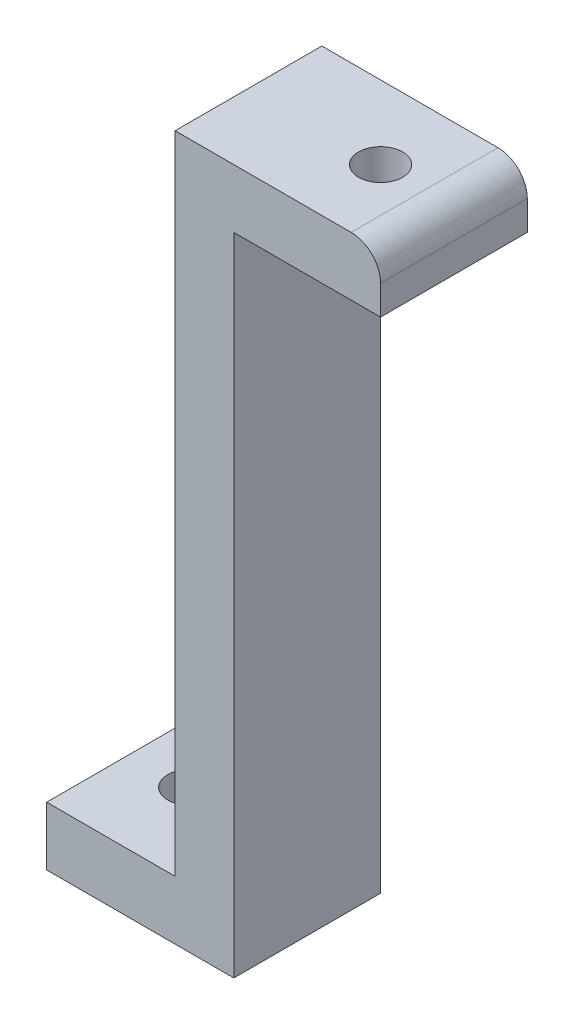
ISO-10303-21;
HEADER;
FILE_DESCRIPTION(('STEP AP214'),'2;1');
FILE_NAME('part.step','',(''),(''),'','','');
FILE_SCHEMA(('AUTOMOTIVE_DESIGN { 1 0 10303 214 1 1 1 1 }'));
ENDSEC;
DATA;
#1=APPLICATION_CONTEXT('core data for automotive mechanical design processes');
#2=APPLICATION_PROTOCOL_DEFINITION('international standard','automotive_design',2000,#1);
#3=PRODUCT_CONTEXT('',#1,'mechanical');
#4=PRODUCT('Part','Part','',(#3));
#5=PRODUCT_RELATED_PRODUCT_CATEGORY('part','',(#4));
#6=PRODUCT_DEFINITION_FORMATION('','',#4);
#7=PRODUCT_DEFINITION_CONTEXT('part definition',#1,'design');
#8=PRODUCT_DEFINITION('design','',#6,#7);
#9=PRODUCT_DEFINITION_SHAPE('','',#8);
#10=(LENGTH_UNIT() NAMED_UNIT(*) SI_UNIT(.MILLI.,.METRE.));
#11=(NAMED_UNIT(*) PLANE_ANGLE_UNIT() SI_UNIT($,.RADIAN.));
#12=(NAMED_UNIT(*) SI_UNIT($,.STERADIAN.) SOLID_ANGLE_UNIT());
#13=UNCERTAINTY_MEASURE_WITH_UNIT(LENGTH_MEASURE(1.E-05),#10,'distance_accuracy_value','');
#14=(GEOMETRIC_REPRESENTATION_CONTEXT(3) GLOBAL_UNCERTAINTY_ASSIGNED_CONTEXT((#13)) GLOBAL_UNIT_ASSIGNED_CONTEXT((#10,
#11,#12)) REPRESENTATION_CONTEXT('',''));
#15=CARTESIAN_POINT('',(0.,0.,0.));
#16=DIRECTION('',(0.,0.,1.));
#17=DIRECTION('',(1.,0.,0.));
#18=AXIS2_PLACEMENT_3D('',#15,#16,#17);
#19=CARTESIAN_POINT('',(0.,-4.,10.));
#20=DIRECTION('',(-1.,0.,0.));
#21=DIRECTION('',(0.,0.,1.));
#22=AXIS2_PLACEMENT_3D('',#19,#20,#21);
#23=PLANE('',#22);
#24=DIRECTION('',(0.,1.,0.));
#25=VECTOR('',#24,1.);
#26=CARTESIAN_POINT('',(0.,-4.,0.));
#27=LINE('',#26,#25);
#28=CARTESIAN_POINT('',(0.,-4.,0.));
#29=VERTEX_POINT('',#28);
#30=CARTESIAN_POINT('',(0.,-2.,0.));
#31=VERTEX_POINT('',#30);
#32=EDGE_CURVE('E144',#29,#31,#27,.T.);
#33=ORIENTED_EDGE('',*,*,#32,.T.);
#34=DIRECTION('',(0.,0.,-1.));
#35=VECTOR('',#34,1.);
#36=CARTESIAN_POINT('',(0.,-2.,10.));
#37=LINE('',#36,#35);
#38=CARTESIAN_POINT('',(0.,-2.,10.));
#39=VERTEX_POINT('',#38);
#40=EDGE_CURVE('E44',#31,#39,#37,.F.);
#41=ORIENTED_EDGE('',*,*,#40,.T.);
#42=DIRECTION('',(0.,1.,0.));
#43=VECTOR('',#42,1.);
#44=CARTESIAN_POINT('',(0.,-4.,10.));
#45=LINE('',#44,#43);
#46=CARTESIAN_POINT('',(0.,-4.,10.));
#47=VERTEX_POINT('',#46);
#48=EDGE_CURVE('E116',#47,#39,#45,.T.);
#49=ORIENTED_EDGE('',*,*,#48,.F.);
#50=DIRECTION('',(0.,0.,-1.));
#51=VECTOR('',#50,1.);
#52=CARTESIAN_POINT('',(0.,-4.,10.));
#53=LINE('',#52,#51);
#54=EDGE_CURVE('E143',#47,#29,#53,.T.);
#55=ORIENTED_EDGE('',*,*,#54,.T.);
#56=EDGE_LOOP('',(#33,#41,#49,#55));
#57=FACE_BOUND('',#56,.T.);
#58=ADVANCED_FACE('F36',(#57),#23,.F.);
#59=CARTESIAN_POINT('',(0.,0.,10.));
#60=DIRECTION('',(0.,-1.,0.));
#61=DIRECTION('',(1.,0.,0.));
#62=AXIS2_PLACEMENT_3D('',#59,#60,#61);
#63=PLANE('',#62);
#64=CARTESIAN_POINT('',(-5.,0.,5.));
#65=DIRECTION('',(0.,-1.,0.));
#66=DIRECTION('',(1.,0.,0.));
#67=AXIS2_PLACEMENT_3D('',#64,#65,#66);
#68=CIRCLE('',#67,1.5);
#69=CARTESIAN_POINT('',(-3.5,0.,5.));
#70=VERTEX_POINT('',#69);
#71=EDGE_CURVE('E208',#70,#70,#68,.T.);
#72=ORIENTED_EDGE('',*,*,#71,.T.);
#73=EDGE_LOOP('',(#72));
#74=FACE_BOUND('',#73,.T.);
#75=DIRECTION('',(-1.,0.,0.));
#76=VECTOR('',#75,1.);
#77=CARTESIAN_POINT('',(0.,0.,10.));
#78=LINE('',#77,#76);
#79=CARTESIAN_POINT('',(-2.,0.,10.));
#80=VERTEX_POINT('',#79);
#81=CARTESIAN_POINT('',(-14.,0.,10.));
#82=VERTEX_POINT('',#81);
#83=EDGE_CURVE('E106',#80,#82,#78,.T.);
#84=ORIENTED_EDGE('',*,*,#83,.F.);
#85=DIRECTION('',(0.,0.,-1.));
#86=VECTOR('',#85,1.);
#87=CARTESIAN_POINT('',(-2.,0.,10.));
#88=LINE('',#87,#86);
#89=CARTESIAN_POINT('',(-2.,0.,0.));
#90=VERTEX_POINT('',#89);
#91=EDGE_CURVE('E124',#80,#90,#88,.T.);
#92=ORIENTED_EDGE('',*,*,#91,.T.);
#93=DIRECTION('',(-1.,0.,0.));
#94=VECTOR('',#93,1.);
#95=CARTESIAN_POINT('',(0.,0.,0.));
#96=LINE('',#95,#94);
#97=CARTESIAN_POINT('',(-14.,0.,0.));
#98=VERTEX_POINT('',#97);
#99=EDGE_CURVE('E121',#90,#98,#96,.T.);
#100=ORIENTED_EDGE('',*,*,#99,.T.);
#101=DIRECTION('',(0.,0.,-1.));
#102=VECTOR('',#101,1.);
#103=CARTESIAN_POINT('',(-14.,0.,10.));
#104=LINE('',#103,#102);
#105=EDGE_CURVE('E119',#82,#98,#104,.T.);
#106=ORIENTED_EDGE('',*,*,#105,.F.);
#107=EDGE_LOOP('',(#84,#92,#100,#106));
#108=FACE_BOUND('',#107,.T.);
#109=ADVANCED_FACE('F120',(#74,#108),#63,.F.);
#110=CARTESIAN_POINT('',(-14.,0.,10.));
#111=DIRECTION('',(1.,0.,0.));
#112=DIRECTION('',(0.,1.,0.));
#113=AXIS2_PLACEMENT_3D('',#110,#111,#112);
#114=PLANE('',#113);
#115=DIRECTION('',(0.,-1.,0.));
#116=VECTOR('',#115,1.);
#117=CARTESIAN_POINT('',(-14.,0.,0.));
#118=LINE('',#117,#116);
#119=CARTESIAN_POINT('',(-14.,-44.,0.));
#120=VERTEX_POINT('',#119);
#121=EDGE_CURVE('E148',#98,#120,#118,.T.);
#122=ORIENTED_EDGE('',*,*,#121,.T.);
#123=DIRECTION('',(0.,0.,-1.));
#124=VECTOR('',#123,1.);
#125=CARTESIAN_POINT('',(-14.,-44.,10.));
#126=LINE('',#125,#124);
#127=CARTESIAN_POINT('',(-14.,-44.,10.));
#128=VERTEX_POINT('',#127);
#129=EDGE_CURVE('E125',#128,#120,#126,.T.);
#130=ORIENTED_EDGE('',*,*,#129,.F.);
#131=DIRECTION('',(0.,-1.,0.));
#132=VECTOR('',#131,1.);
#133=CARTESIAN_POINT('',(-14.,0.,10.));
#134=LINE('',#133,#132);
#135=EDGE_CURVE('E110',#82,#128,#134,.T.);
#136=ORIENTED_EDGE('',*,*,#135,.F.);
#137=ORIENTED_EDGE('',*,*,#105,.T.);
#138=EDGE_LOOP('',(#122,#130,#136,#137));
#139=FACE_BOUND('',#138,.T.);
#140=ADVANCED_FACE('F127',(#139),#114,.F.);
#141=CARTESIAN_POINT('',(-14.,-44.,10.));
#142=DIRECTION('',(0.,-1.,0.));
#143=DIRECTION('',(0.,0.,-1.));
#144=AXIS2_PLACEMENT_3D('',#141,#142,#143);
#145=PLANE('',#144);
#146=CARTESIAN_POINT('',(-18.75,-44.,4.25));
#147=DIRECTION('',(0.,1.,0.));
#148=DIRECTION('',(0.,0.,1.));
#149=AXIS2_PLACEMENT_3D('',#146,#147,#148);
#150=CIRCLE('',#149,1.5);
#151=CARTESIAN_POINT('',(-18.75,-44.,5.75));
#152=VERTEX_POINT('',#151);
#153=EDGE_CURVE('E177',#152,#152,#150,.T.);
#154=ORIENTED_EDGE('',*,*,#153,.F.);
#155=EDGE_LOOP('',(#154));
#156=FACE_BOUND('',#155,.T.);
#157=DIRECTION('',(-1.,0.,0.));
#158=VECTOR('',#157,1.);
#159=CARTESIAN_POINT('',(-14.,-44.,0.));
#160=LINE('',#159,#158);
#161=CARTESIAN_POINT('',(-22.75,-44.,0.));
#162=VERTEX_POINT('',#161);
#163=EDGE_CURVE('E150',#120,#162,#160,.T.);
#164=ORIENTED_EDGE('',*,*,#163,.T.);
#165=DIRECTION('',(0.,0.,-1.));
#166=VECTOR('',#165,1.);
#167=CARTESIAN_POINT('',(-22.75,-44.,10.));
#168=LINE('',#167,#166);
#169=CARTESIAN_POINT('',(-22.75,-44.,10.));
#170=VERTEX_POINT('',#169);
#171=EDGE_CURVE('E171',#170,#162,#168,.T.);
#172=ORIENTED_EDGE('',*,*,#171,.F.);
#173=DIRECTION('',(-1.,0.,0.));
#174=VECTOR('',#173,1.);
#175=CARTESIAN_POINT('',(-14.,-44.,10.));
#176=LINE('',#175,#174);
#177=EDGE_CURVE('E130',#128,#170,#176,.T.);
#178=ORIENTED_EDGE('',*,*,#177,.F.);
#179=ORIENTED_EDGE('',*,*,#129,.T.);
#180=EDGE_LOOP('',(#164,#172,#178,#179));
#181=FACE_BOUND('',#180,.T.);
#182=ADVANCED_FACE('F184',(#156,#181),#145,.F.);
#183=CARTESIAN_POINT('',(-22.75,-44.,10.));
#184=DIRECTION('',(1.,0.,0.));
#185=DIRECTION('',(0.,0.,-1.));
#186=AXIS2_PLACEMENT_3D('',#183,#184,#185);
#187=PLANE('',#186);
#188=DIRECTION('',(0.,-1.,0.));
#189=VECTOR('',#188,1.);
#190=CARTESIAN_POINT('',(-22.75,-44.,0.));
#191=LINE('',#190,#189);
#192=CARTESIAN_POINT('',(-22.75,-48.,0.));
#193=VERTEX_POINT('',#192);
#194=EDGE_CURVE('E152',#162,#193,#191,.T.);
#195=ORIENTED_EDGE('',*,*,#194,.T.);
#196=DIRECTION('',(0.,0.,-1.));
#197=VECTOR('',#196,1.);
#198=CARTESIAN_POINT('',(-22.75,-48.,10.));
#199=LINE('',#198,#197);
#200=CARTESIAN_POINT('',(-22.75,-48.,10.));
#201=VERTEX_POINT('',#200);
#202=EDGE_CURVE('E168',#201,#193,#199,.T.);
#203=ORIENTED_EDGE('',*,*,#202,.F.);
#204=DIRECTION('',(0.,-1.,0.));
#205=VECTOR('',#204,1.);
#206=CARTESIAN_POINT('',(-22.75,-44.,10.));
#207=LINE('',#206,#205);
#208=EDGE_CURVE('E132',#170,#201,#207,.T.);
#209=ORIENTED_EDGE('',*,*,#208,.F.);
#210=ORIENTED_EDGE('',*,*,#171,.T.);
#211=EDGE_LOOP('',(#195,#203,#209,#210));
#212=FACE_BOUND('',#211,.T.);
#213=ADVANCED_FACE('F191',(#212),#187,.F.);
#214=CARTESIAN_POINT('',(-22.75,-48.,10.));
#215=DIRECTION('',(0.,1.,0.));
#216=DIRECTION('',(0.,0.,1.));
#217=AXIS2_PLACEMENT_3D('',#214,#215,#216);
#218=PLANE('',#217);
#219=CARTESIAN_POINT('',(-18.75,-48.,4.25));
#220=DIRECTION('',(0.,1.,0.));
#221=DIRECTION('',(0.,0.,1.));
#222=AXIS2_PLACEMENT_3D('',#219,#220,#221);
#223=CIRCLE('',#222,1.5);
#224=CARTESIAN_POINT('',(-18.75,-48.,5.75));
#225=VERTEX_POINT('',#224);
#226=EDGE_CURVE('E146',#225,#225,#223,.T.);
#227=ORIENTED_EDGE('',*,*,#226,.T.);
#228=EDGE_LOOP('',(#227));
#229=FACE_BOUND('',#228,.T.);
#230=DIRECTION('',(1.,0.,0.));
#231=VECTOR('',#230,1.);
#232=CARTESIAN_POINT('',(-22.75,-48.,0.));
#233=LINE('',#232,#231);
#234=CARTESIAN_POINT('',(-10.,-48.,0.));
#235=VERTEX_POINT('',#234);
#236=EDGE_CURVE('E154',#193,#235,#233,.T.);
#237=ORIENTED_EDGE('',*,*,#236,.T.);
#238=DIRECTION('',(0.,0.,-1.));
#239=VECTOR('',#238,1.);
#240=CARTESIAN_POINT('',(-10.,-48.,10.));
#241=LINE('',#240,#239);
#242=CARTESIAN_POINT('',(-10.,-48.,10.));
#243=VERTEX_POINT('',#242);
#244=EDGE_CURVE('E165',#243,#235,#241,.T.);
#245=ORIENTED_EDGE('',*,*,#244,.F.);
#246=DIRECTION('',(1.,0.,0.));
#247=VECTOR('',#246,1.);
#248=CARTESIAN_POINT('',(-22.75,-48.,10.));
#249=LINE('',#248,#247);
#250=EDGE_CURVE('E137',#201,#243,#249,.T.);
#251=ORIENTED_EDGE('',*,*,#250,.F.);
#252=ORIENTED_EDGE('',*,*,#202,.T.);
#253=EDGE_LOOP('',(#237,#245,#251,#252));
#254=FACE_BOUND('',#253,.T.);
#255=ADVANCED_FACE('F194',(#229,#254),#218,.F.);
#256=CARTESIAN_POINT('',(-10.,-48.,10.));
#257=DIRECTION('',(-1.,0.,0.));
#258=DIRECTION('',(0.,0.,1.));
#259=AXIS2_PLACEMENT_3D('',#256,#257,#258);
#260=PLANE('',#259);
#261=DIRECTION('',(0.,1.,0.));
#262=VECTOR('',#261,1.);
#263=CARTESIAN_POINT('',(-10.,-48.,0.));
#264=LINE('',#263,#262);
#265=CARTESIAN_POINT('',(-10.,-4.,0.));
#266=VERTEX_POINT('',#265);
#267=EDGE_CURVE('E156',#235,#266,#264,.T.);
#268=ORIENTED_EDGE('',*,*,#267,.T.);
#269=DIRECTION('',(0.,0.,-1.));
#270=VECTOR('',#269,1.);
#271=CARTESIAN_POINT('',(-10.,-4.,10.));
#272=LINE('',#271,#270);
#273=CARTESIAN_POINT('',(-10.,-4.,10.));
#274=VERTEX_POINT('',#273);
#275=EDGE_CURVE('E162',#274,#266,#272,.T.);
#276=ORIENTED_EDGE('',*,*,#275,.F.);
#277=DIRECTION('',(0.,1.,0.));
#278=VECTOR('',#277,1.);
#279=CARTESIAN_POINT('',(-10.,-48.,10.));
#280=LINE('',#279,#278);
#281=EDGE_CURVE('E139',#243,#274,#280,.T.);
#282=ORIENTED_EDGE('',*,*,#281,.F.);
#283=ORIENTED_EDGE('',*,*,#244,.T.);
#284=EDGE_LOOP('',(#268,#276,#282,#283));
#285=FACE_BOUND('',#284,.T.);
#286=ADVANCED_FACE('F199',(#285),#260,.F.);
#287=CARTESIAN_POINT('',(-10.,-4.,10.));
#288=DIRECTION('',(0.,1.,0.));
#289=DIRECTION('',(0.,0.,1.));
#290=AXIS2_PLACEMENT_3D('',#287,#288,#289);
#291=PLANE('',#290);
#292=CARTESIAN_POINT('',(-5.,-4.,5.));
#293=DIRECTION('',(0.,-1.,0.));
#294=DIRECTION('',(0.,0.,-1.));
#295=AXIS2_PLACEMENT_3D('',#292,#293,#294);
#296=CIRCLE('',#295,1.5);
#297=CARTESIAN_POINT('',(-5.,-4.,3.5));
#298=VERTEX_POINT('',#297);
#299=EDGE_CURVE('E211',#298,#298,#296,.T.);
#300=ORIENTED_EDGE('',*,*,#299,.F.);
#301=EDGE_LOOP('',(#300));
#302=FACE_BOUND('',#301,.T.);
#303=DIRECTION('',(1.,0.,0.));
#304=VECTOR('',#303,1.);
#305=CARTESIAN_POINT('',(-10.,-4.,0.));
#306=LINE('',#305,#304);
#307=EDGE_CURVE('E158',#266,#29,#306,.T.);
#308=ORIENTED_EDGE('',*,*,#307,.T.);
#309=ORIENTED_EDGE('',*,*,#54,.F.);
#310=DIRECTION('',(1.,0.,0.));
#311=VECTOR('',#310,1.);
#312=CARTESIAN_POINT('',(-10.,-4.,10.));
#313=LINE('',#312,#311);
#314=EDGE_CURVE('E141',#274,#47,#313,.T.);
#315=ORIENTED_EDGE('',*,*,#314,.F.);
#316=ORIENTED_EDGE('',*,*,#275,.T.);
#317=EDGE_LOOP('',(#308,#309,#315,#316));
#318=FACE_BOUND('',#317,.T.);
#319=ADVANCED_FACE('F203',(#302,#318),#291,.F.);
#320=CARTESIAN_POINT('',(0.,0.,10.));
#321=DIRECTION('',(0.,0.,1.));
#322=DIRECTION('',(1.,0.,0.));
#323=AXIS2_PLACEMENT_3D('',#320,#321,#322);
#324=PLANE('',#323);
#325=ORIENTED_EDGE('',*,*,#48,.T.);
#326=CARTESIAN_POINT('',(-2.,-2.,10.));
#327=DIRECTION('',(0.,0.,1.));
#328=DIRECTION('',(1.,0.,0.));
#329=AXIS2_PLACEMENT_3D('',#326,#327,#328);
#330=CIRCLE('',#329,2.);
#331=EDGE_CURVE('E11',#39,#80,#330,.T.);
#332=ORIENTED_EDGE('',*,*,#331,.T.);
#333=ORIENTED_EDGE('',*,*,#83,.T.);
#334=ORIENTED_EDGE('',*,*,#135,.T.);
#335=ORIENTED_EDGE('',*,*,#177,.T.);
#336=ORIENTED_EDGE('',*,*,#208,.T.);
#337=ORIENTED_EDGE('',*,*,#250,.T.);
#338=ORIENTED_EDGE('',*,*,#281,.T.);
#339=ORIENTED_EDGE('',*,*,#314,.T.);
#340=EDGE_LOOP('',(#325,#332,#333,#334,#335,#336,#337,#338,#339));
#341=FACE_BOUND('',#340,.T.);
#342=ADVANCED_FACE('F108',(#341),#324,.T.);
#343=CARTESIAN_POINT('',(0.,0.,0.));
#344=DIRECTION('',(0.,0.,1.));
#345=DIRECTION('',(1.,0.,0.));
#346=AXIS2_PLACEMENT_3D('',#343,#344,#345);
#347=PLANE('',#346);
#348=ORIENTED_EDGE('',*,*,#99,.F.);
#349=CARTESIAN_POINT('',(-2.,-2.,0.));
#350=DIRECTION('',(0.,0.,1.));
#351=DIRECTION('',(1.,0.,0.));
#352=AXIS2_PLACEMENT_3D('',#349,#350,#351);
#353=CIRCLE('',#352,2.);
#354=EDGE_CURVE('E58',#90,#31,#353,.F.);
#355=ORIENTED_EDGE('',*,*,#354,.T.);
#356=ORIENTED_EDGE('',*,*,#32,.F.);
#357=ORIENTED_EDGE('',*,*,#307,.F.);
#358=ORIENTED_EDGE('',*,*,#267,.F.);
#359=ORIENTED_EDGE('',*,*,#236,.F.);
#360=ORIENTED_EDGE('',*,*,#194,.F.);
#361=ORIENTED_EDGE('',*,*,#163,.F.);
#362=ORIENTED_EDGE('',*,*,#121,.F.);
#363=EDGE_LOOP('',(#348,#355,#356,#357,#358,#359,#360,#361,#362));
#364=FACE_BOUND('',#363,.T.);
#365=ADVANCED_FACE('F180',(#364),#347,.F.);
#366=CARTESIAN_POINT('',(-18.75,-54.,4.25));
#367=DIRECTION('',(0.,1.,0.));
#368=DIRECTION('',(0.,0.,1.));
#369=AXIS2_PLACEMENT_3D('',#366,#367,#368);
#370=CYLINDRICAL_SURFACE('',#369,1.5);
#371=ORIENTED_EDGE('',*,*,#153,.T.);
#372=EDGE_LOOP('',(#371));
#373=FACE_BOUND('',#372,.T.);
#374=ORIENTED_EDGE('',*,*,#226,.F.);
#375=EDGE_LOOP('',(#374));
#376=FACE_BOUND('',#375,.T.);
#377=ADVANCED_FACE('F247',(#373,#376),#370,.F.);
#378=CARTESIAN_POINT('',(-5.,6.,5.));
#379=DIRECTION('',(0.,-1.,0.));
#380=DIRECTION('',(0.,0.,-1.));
#381=AXIS2_PLACEMENT_3D('',#378,#379,#380);
#382=CYLINDRICAL_SURFACE('',#381,1.5);
#383=ORIENTED_EDGE('',*,*,#299,.T.);
#384=EDGE_LOOP('',(#383));
#385=FACE_BOUND('',#384,.T.);
#386=ORIENTED_EDGE('',*,*,#71,.F.);
#387=EDGE_LOOP('',(#386));
#388=FACE_BOUND('',#387,.T.);
#389=ADVANCED_FACE('F215',(#385,#388),#382,.F.);
#390=CARTESIAN_POINT('',(-2.,-2.,10.));
#391=DIRECTION('',(0.,0.,-1.));
#392=DIRECTION('',(-1.,0.,0.));
#393=AXIS2_PLACEMENT_3D('',#390,#391,#392);
#394=CYLINDRICAL_SURFACE('',#393,2.);
#395=ORIENTED_EDGE('',*,*,#331,.F.);
#396=ORIENTED_EDGE('',*,*,#40,.F.);
#397=ORIENTED_EDGE('',*,*,#354,.F.);
#398=ORIENTED_EDGE('',*,*,#91,.F.);
#399=EDGE_LOOP('',(#395,#396,#397,#398));
#400=FACE_BOUND('',#399,.T.);
#401=ADVANCED_FACE('F38',(#400),#394,.T.);
#402=CLOSED_SHELL('',(#58,#109,#140,#182,#213,#255,#286,#319,#342,#365,#377,#389,#401));
#403=MANIFOLD_SOLID_BREP('B2',#402);
#404=ADVANCED_BREP_SHAPE_REPRESENTATION('',(#18,#403),#14);
#405=SHAPE_DEFINITION_REPRESENTATION(#9,#404);
ENDSEC;
END-ISO-10303-21;
